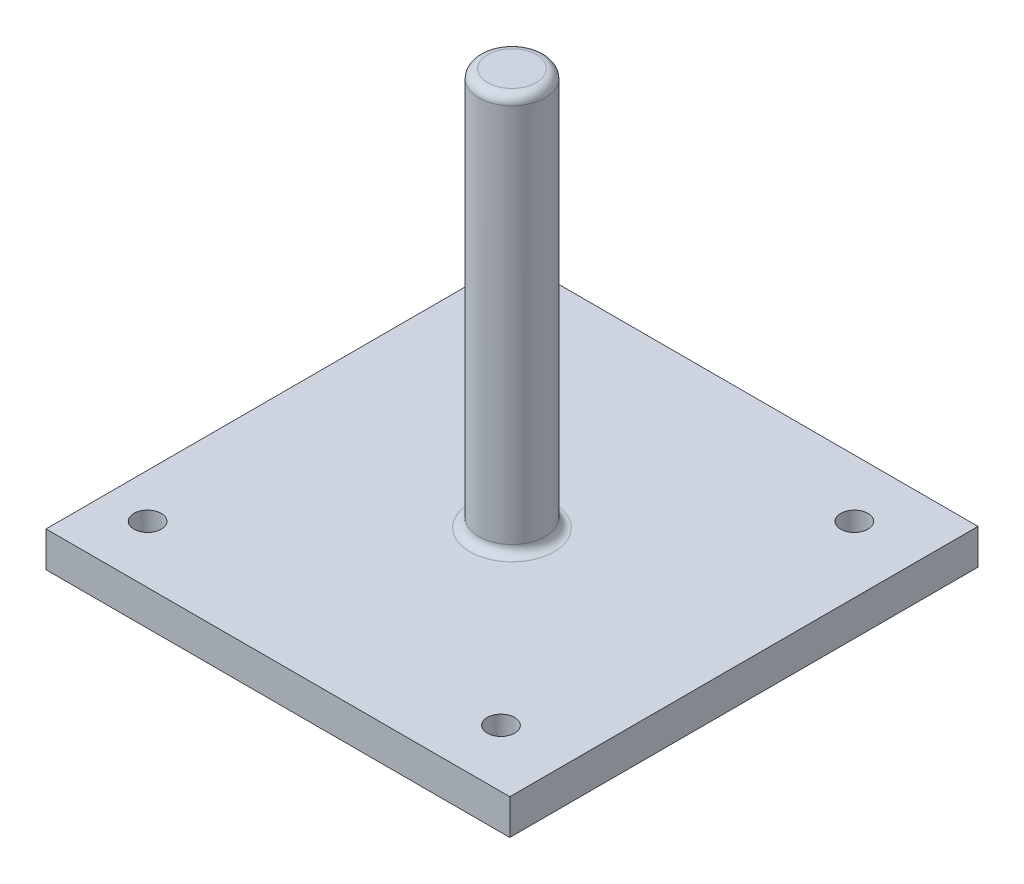
ISO-10303-21;
HEADER;
FILE_DESCRIPTION(('STEP AP214'),'2;1');
FILE_NAME('part.step','',(''),(''),'','','');
FILE_SCHEMA(('AUTOMOTIVE_DESIGN { 1 0 10303 214 1 1 1 1 }'));
ENDSEC;
DATA;
#1=APPLICATION_CONTEXT('core data for automotive mechanical design processes');
#2=APPLICATION_PROTOCOL_DEFINITION('international standard','automotive_design',2000,#1);
#3=PRODUCT_CONTEXT('',#1,'mechanical');
#4=PRODUCT('Part','Part','',(#3));
#5=PRODUCT_RELATED_PRODUCT_CATEGORY('part','',(#4));
#6=PRODUCT_DEFINITION_FORMATION('','',#4);
#7=PRODUCT_DEFINITION_CONTEXT('part definition',#1,'design');
#8=PRODUCT_DEFINITION('design','',#6,#7);
#9=PRODUCT_DEFINITION_SHAPE('','',#8);
#10=(LENGTH_UNIT() NAMED_UNIT(*) SI_UNIT(.MILLI.,.METRE.));
#11=(NAMED_UNIT(*) PLANE_ANGLE_UNIT() SI_UNIT($,.RADIAN.));
#12=(NAMED_UNIT(*) SI_UNIT($,.STERADIAN.) SOLID_ANGLE_UNIT());
#13=UNCERTAINTY_MEASURE_WITH_UNIT(LENGTH_MEASURE(1.E-05),#10,'distance_accuracy_value','');
#14=(GEOMETRIC_REPRESENTATION_CONTEXT(3) GLOBAL_UNCERTAINTY_ASSIGNED_CONTEXT((#13)) GLOBAL_UNIT_ASSIGNED_CONTEXT((#10,
#11,#12)) REPRESENTATION_CONTEXT('',''));
#15=CARTESIAN_POINT('',(0.,0.,0.));
#16=DIRECTION('',(0.,0.,1.));
#17=DIRECTION('',(1.,0.,0.));
#18=AXIS2_PLACEMENT_3D('',#15,#16,#17);
#19=CARTESIAN_POINT('',(0.,8.,0.));
#20=DIRECTION('',(1.,0.,0.));
#21=DIRECTION('',(0.,0.,-1.));
#22=AXIS2_PLACEMENT_3D('',#19,#20,#21);
#23=PLANE('',#22);
#24=DIRECTION('',(0.,0.,1.));
#25=VECTOR('',#24,1.);
#26=CARTESIAN_POINT('',(0.,0.,0.));
#27=LINE('',#26,#25);
#28=CARTESIAN_POINT('',(0.,0.,-106.));
#29=VERTEX_POINT('',#28);
#30=CARTESIAN_POINT('',(0.,0.,0.));
#31=VERTEX_POINT('',#30);
#32=EDGE_CURVE('E109',#29,#31,#27,.T.);
#33=ORIENTED_EDGE('',*,*,#32,.T.);
#34=DIRECTION('',(0.,-1.,0.));
#35=VECTOR('',#34,1.);
#36=CARTESIAN_POINT('',(0.,8.,0.));
#37=LINE('',#36,#35);
#38=CARTESIAN_POINT('',(0.,8.,0.));
#39=VERTEX_POINT('',#38);
#40=EDGE_CURVE('E100',#39,#31,#37,.T.);
#41=ORIENTED_EDGE('',*,*,#40,.F.);
#42=DIRECTION('',(0.,0.,1.));
#43=VECTOR('',#42,1.);
#44=CARTESIAN_POINT('',(0.,8.,0.));
#45=LINE('',#44,#43);
#46=CARTESIAN_POINT('',(0.,8.,-106.));
#47=VERTEX_POINT('',#46);
#48=EDGE_CURVE('E94',#47,#39,#45,.T.);
#49=ORIENTED_EDGE('',*,*,#48,.F.);
#50=DIRECTION('',(0.,-1.,0.));
#51=VECTOR('',#50,1.);
#52=CARTESIAN_POINT('',(0.,8.,-106.));
#53=LINE('',#52,#51);
#54=EDGE_CURVE('E105',#47,#29,#53,.T.);
#55=ORIENTED_EDGE('',*,*,#54,.T.);
#56=EDGE_LOOP('',(#33,#41,#49,#55));
#57=FACE_BOUND('',#56,.T.);
#58=ADVANCED_FACE('F41',(#57),#23,.F.);
#59=CARTESIAN_POINT('',(0.,8.,0.));
#60=DIRECTION('',(0.,0.,-1.));
#61=DIRECTION('',(-1.,0.,0.));
#62=AXIS2_PLACEMENT_3D('',#59,#60,#61);
#63=PLANE('',#62);
#64=DIRECTION('',(1.,0.,0.));
#65=VECTOR('',#64,1.);
#66=CARTESIAN_POINT('',(0.,0.,0.));
#67=LINE('',#66,#65);
#68=CARTESIAN_POINT('',(105.,0.,0.));
#69=VERTEX_POINT('',#68);
#70=EDGE_CURVE('E99',#31,#69,#67,.T.);
#71=ORIENTED_EDGE('',*,*,#70,.T.);
#72=DIRECTION('',(0.,-1.,0.));
#73=VECTOR('',#72,1.);
#74=CARTESIAN_POINT('',(105.,8.,0.));
#75=LINE('',#74,#73);
#76=CARTESIAN_POINT('',(105.,8.,0.));
#77=VERTEX_POINT('',#76);
#78=EDGE_CURVE('E97',#77,#69,#75,.T.);
#79=ORIENTED_EDGE('',*,*,#78,.F.);
#80=DIRECTION('',(1.,0.,0.));
#81=VECTOR('',#80,1.);
#82=CARTESIAN_POINT('',(0.,8.,0.));
#83=LINE('',#82,#81);
#84=EDGE_CURVE('E89',#39,#77,#83,.T.);
#85=ORIENTED_EDGE('',*,*,#84,.F.);
#86=ORIENTED_EDGE('',*,*,#40,.T.);
#87=EDGE_LOOP('',(#71,#79,#85,#86));
#88=FACE_BOUND('',#87,.T.);
#89=ADVANCED_FACE('F98',(#88),#63,.F.);
#90=CARTESIAN_POINT('',(105.,8.,0.));
#91=DIRECTION('',(-1.,0.,0.));
#92=DIRECTION('',(0.,0.,1.));
#93=AXIS2_PLACEMENT_3D('',#90,#91,#92);
#94=PLANE('',#93);
#95=DIRECTION('',(0.,0.,-1.));
#96=VECTOR('',#95,1.);
#97=CARTESIAN_POINT('',(105.,0.,0.));
#98=LINE('',#97,#96);
#99=CARTESIAN_POINT('',(105.,0.,-106.));
#100=VERTEX_POINT('',#99);
#101=EDGE_CURVE('E75',#69,#100,#98,.T.);
#102=ORIENTED_EDGE('',*,*,#101,.T.);
#103=DIRECTION('',(0.,-1.,0.));
#104=VECTOR('',#103,1.);
#105=CARTESIAN_POINT('',(105.,8.,-106.));
#106=LINE('',#105,#104);
#107=CARTESIAN_POINT('',(105.,8.,-106.));
#108=VERTEX_POINT('',#107);
#109=EDGE_CURVE('E101',#108,#100,#106,.T.);
#110=ORIENTED_EDGE('',*,*,#109,.F.);
#111=DIRECTION('',(0.,0.,-1.));
#112=VECTOR('',#111,1.);
#113=CARTESIAN_POINT('',(105.,8.,0.));
#114=LINE('',#113,#112);
#115=EDGE_CURVE('E92',#77,#108,#114,.T.);
#116=ORIENTED_EDGE('',*,*,#115,.F.);
#117=ORIENTED_EDGE('',*,*,#78,.T.);
#118=EDGE_LOOP('',(#102,#110,#116,#117));
#119=FACE_BOUND('',#118,.T.);
#120=ADVANCED_FACE('F103',(#119),#94,.F.);
#121=CARTESIAN_POINT('',(0.,8.,-106.));
#122=DIRECTION('',(0.,0.,1.));
#123=DIRECTION('',(1.,0.,0.));
#124=AXIS2_PLACEMENT_3D('',#121,#122,#123);
#125=PLANE('',#124);
#126=DIRECTION('',(-1.,0.,0.));
#127=VECTOR('',#126,1.);
#128=CARTESIAN_POINT('',(0.,0.,-106.));
#129=LINE('',#128,#127);
#130=EDGE_CURVE('E81',#100,#29,#129,.T.);
#131=ORIENTED_EDGE('',*,*,#130,.T.);
#132=ORIENTED_EDGE('',*,*,#54,.F.);
#133=DIRECTION('',(-1.,0.,0.));
#134=VECTOR('',#133,1.);
#135=CARTESIAN_POINT('',(0.,8.,-106.));
#136=LINE('',#135,#134);
#137=EDGE_CURVE('E58',#108,#47,#136,.T.);
#138=ORIENTED_EDGE('',*,*,#137,.F.);
#139=ORIENTED_EDGE('',*,*,#109,.T.);
#140=EDGE_LOOP('',(#131,#132,#138,#139));
#141=FACE_BOUND('',#140,.T.);
#142=ADVANCED_FACE('F172',(#141),#125,.F.);
#143=CARTESIAN_POINT('',(0.,8.,0.));
#144=DIRECTION('',(0.,-1.,0.));
#145=DIRECTION('',(0.,0.,-1.));
#146=AXIS2_PLACEMENT_3D('',#143,#144,#145);
#147=PLANE('',#146);
#148=CARTESIAN_POINT('',(52.5,8.,-53.0000000000002));
#149=DIRECTION('',(0.,-1.,0.));
#150=DIRECTION('',(0.,0.,-1.));
#151=AXIS2_PLACEMENT_3D('',#148,#149,#150);
#152=CIRCLE('',#151,9.5);
#153=CARTESIAN_POINT('',(52.5,8.,-62.5000000000002));
#154=VERTEX_POINT('',#153);
#155=EDGE_CURVE('E50',#154,#154,#152,.T.);
#156=ORIENTED_EDGE('',*,*,#155,.T.);
#157=EDGE_LOOP('',(#156));
#158=FACE_BOUND('',#157,.T.);
#159=CARTESIAN_POINT('',(10.0000000000007,8.,-13.0000000000004));
#160=DIRECTION('',(0.,1.,0.));
#161=DIRECTION('',(0.,0.,1.));
#162=AXIS2_PLACEMENT_3D('',#159,#160,#161);
#163=CIRCLE('',#162,3.1);
#164=CARTESIAN_POINT('',(10.0000000000007,8.,-9.90000000000038));
#165=VERTEX_POINT('',#164);
#166=EDGE_CURVE('E208',#165,#165,#163,.T.);
#167=ORIENTED_EDGE('',*,*,#166,.F.);
#168=EDGE_LOOP('',(#167));
#169=FACE_BOUND('',#168,.T.);
#170=CARTESIAN_POINT('',(10.0000000000004,8.,-93.0000000000004));
#171=DIRECTION('',(0.,1.,0.));
#172=DIRECTION('',(0.,0.,1.));
#173=AXIS2_PLACEMENT_3D('',#170,#171,#172);
#174=CIRCLE('',#173,3.10000000000001);
#175=CARTESIAN_POINT('',(10.0000000000004,8.,-89.9000000000004));
#176=VERTEX_POINT('',#175);
#177=EDGE_CURVE('E203',#176,#176,#174,.T.);
#178=ORIENTED_EDGE('',*,*,#177,.F.);
#179=EDGE_LOOP('',(#178));
#180=FACE_BOUND('',#179,.T.);
#181=CARTESIAN_POINT('',(90.0000000000004,8.,-93.0000000000006));
#182=DIRECTION('',(0.,1.,0.));
#183=DIRECTION('',(0.,0.,1.));
#184=AXIS2_PLACEMENT_3D('',#181,#182,#183);
#185=CIRCLE('',#184,3.1);
#186=CARTESIAN_POINT('',(90.0000000000004,8.,-89.9000000000006));
#187=VERTEX_POINT('',#186);
#188=EDGE_CURVE('E201',#187,#187,#185,.T.);
#189=ORIENTED_EDGE('',*,*,#188,.F.);
#190=EDGE_LOOP('',(#189));
#191=FACE_BOUND('',#190,.T.);
#192=CARTESIAN_POINT('',(90.0000000000007,8.,-13.0000000000006));
#193=DIRECTION('',(0.,1.,0.));
#194=DIRECTION('',(0.,0.,1.));
#195=AXIS2_PLACEMENT_3D('',#192,#193,#194);
#196=CIRCLE('',#195,3.1);
#197=CARTESIAN_POINT('',(90.0000000000007,8.,-9.90000000000059));
#198=VERTEX_POINT('',#197);
#199=EDGE_CURVE('E124',#198,#198,#196,.T.);
#200=ORIENTED_EDGE('',*,*,#199,.F.);
#201=EDGE_LOOP('',(#200));
#202=FACE_BOUND('',#201,.T.);
#203=ORIENTED_EDGE('',*,*,#48,.T.);
#204=ORIENTED_EDGE('',*,*,#84,.T.);
#205=ORIENTED_EDGE('',*,*,#115,.T.);
#206=ORIENTED_EDGE('',*,*,#137,.T.);
#207=EDGE_LOOP('',(#203,#204,#205,#206));
#208=FACE_BOUND('',#207,.T.);
#209=ADVANCED_FACE('F90',(#158,#169,#180,#191,#202,#208),#147,.F.);
#210=CARTESIAN_POINT('',(0.,0.,0.));
#211=DIRECTION('',(0.,-1.,0.));
#212=DIRECTION('',(0.,0.,-1.));
#213=AXIS2_PLACEMENT_3D('',#210,#211,#212);
#214=PLANE('',#213);
#215=CARTESIAN_POINT('',(10.0000000000007,0.,-13.0000000000004));
#216=DIRECTION('',(0.,-1.,0.));
#217=DIRECTION('',(0.,0.,-1.));
#218=AXIS2_PLACEMENT_3D('',#215,#216,#217);
#219=CIRCLE('',#218,3.1);
#220=CARTESIAN_POINT('',(10.0000000000007,0.,-16.1000000000004));
#221=VERTEX_POINT('',#220);
#222=EDGE_CURVE('E112',#221,#221,#219,.T.);
#223=ORIENTED_EDGE('',*,*,#222,.F.);
#224=EDGE_LOOP('',(#223));
#225=FACE_BOUND('',#224,.T.);
#226=CARTESIAN_POINT('',(10.0000000000004,0.,-93.0000000000004));
#227=DIRECTION('',(0.,-1.,0.));
#228=DIRECTION('',(0.,0.,-1.));
#229=AXIS2_PLACEMENT_3D('',#226,#227,#228);
#230=CIRCLE('',#229,3.10000000000001);
#231=CARTESIAN_POINT('',(10.0000000000004,0.,-96.1000000000004));
#232=VERTEX_POINT('',#231);
#233=EDGE_CURVE('E127',#232,#232,#230,.T.);
#234=ORIENTED_EDGE('',*,*,#233,.F.);
#235=EDGE_LOOP('',(#234));
#236=FACE_BOUND('',#235,.T.);
#237=CARTESIAN_POINT('',(90.0000000000004,0.,-93.0000000000006));
#238=DIRECTION('',(0.,-1.,0.));
#239=DIRECTION('',(0.,0.,-1.));
#240=AXIS2_PLACEMENT_3D('',#237,#238,#239);
#241=CIRCLE('',#240,3.1);
#242=CARTESIAN_POINT('',(90.0000000000004,0.,-96.1000000000006));
#243=VERTEX_POINT('',#242);
#244=EDGE_CURVE('E123',#243,#243,#241,.T.);
#245=ORIENTED_EDGE('',*,*,#244,.F.);
#246=EDGE_LOOP('',(#245));
#247=FACE_BOUND('',#246,.T.);
#248=CARTESIAN_POINT('',(90.0000000000007,0.,-13.0000000000006));
#249=DIRECTION('',(0.,-1.,0.));
#250=DIRECTION('',(0.,0.,-1.));
#251=AXIS2_PLACEMENT_3D('',#248,#249,#250);
#252=CIRCLE('',#251,3.1);
#253=CARTESIAN_POINT('',(90.0000000000007,0.,-16.1000000000006));
#254=VERTEX_POINT('',#253);
#255=EDGE_CURVE('E120',#254,#254,#252,.T.);
#256=ORIENTED_EDGE('',*,*,#255,.F.);
#257=EDGE_LOOP('',(#256));
#258=FACE_BOUND('',#257,.T.);
#259=ORIENTED_EDGE('',*,*,#32,.F.);
#260=ORIENTED_EDGE('',*,*,#130,.F.);
#261=ORIENTED_EDGE('',*,*,#101,.F.);
#262=ORIENTED_EDGE('',*,*,#70,.F.);
#263=EDGE_LOOP('',(#259,#260,#261,#262));
#264=FACE_BOUND('',#263,.T.);
#265=ADVANCED_FACE('F175',(#225,#236,#247,#258,#264),#214,.T.);
#266=CARTESIAN_POINT('',(90.0000000000007,-2.,-13.0000000000006));
#267=DIRECTION('',(0.,1.,0.));
#268=DIRECTION('',(0.,0.,1.));
#269=AXIS2_PLACEMENT_3D('',#266,#267,#268);
#270=CYLINDRICAL_SURFACE('',#269,3.1);
#271=ORIENTED_EDGE('',*,*,#255,.T.);
#272=EDGE_LOOP('',(#271));
#273=FACE_BOUND('',#272,.T.);
#274=ORIENTED_EDGE('',*,*,#199,.T.);
#275=EDGE_LOOP('',(#274));
#276=FACE_BOUND('',#275,.T.);
#277=ADVANCED_FACE('F178',(#273,#276),#270,.F.);
#278=CARTESIAN_POINT('',(90.0000000000004,-2.,-93.0000000000006));
#279=DIRECTION('',(0.,1.,0.));
#280=DIRECTION('',(0.,0.,1.));
#281=AXIS2_PLACEMENT_3D('',#278,#279,#280);
#282=CYLINDRICAL_SURFACE('',#281,3.1);
#283=ORIENTED_EDGE('',*,*,#244,.T.);
#284=EDGE_LOOP('',(#283));
#285=FACE_BOUND('',#284,.T.);
#286=ORIENTED_EDGE('',*,*,#188,.T.);
#287=EDGE_LOOP('',(#286));
#288=FACE_BOUND('',#287,.T.);
#289=ADVANCED_FACE('F184',(#285,#288),#282,.F.);
#290=CARTESIAN_POINT('',(10.0000000000004,-2.,-93.0000000000004));
#291=DIRECTION('',(0.,1.,0.));
#292=DIRECTION('',(0.,0.,1.));
#293=AXIS2_PLACEMENT_3D('',#290,#291,#292);
#294=CYLINDRICAL_SURFACE('',#293,3.10000000000001);
#295=ORIENTED_EDGE('',*,*,#233,.T.);
#296=EDGE_LOOP('',(#295));
#297=FACE_BOUND('',#296,.T.);
#298=ORIENTED_EDGE('',*,*,#177,.T.);
#299=EDGE_LOOP('',(#298));
#300=FACE_BOUND('',#299,.T.);
#301=ADVANCED_FACE('F188',(#297,#300),#294,.F.);
#302=CARTESIAN_POINT('',(10.0000000000007,-2.,-13.0000000000004));
#303=DIRECTION('',(0.,1.,0.));
#304=DIRECTION('',(0.,0.,1.));
#305=AXIS2_PLACEMENT_3D('',#302,#303,#304);
#306=CYLINDRICAL_SURFACE('',#305,3.1);
#307=ORIENTED_EDGE('',*,*,#222,.T.);
#308=EDGE_LOOP('',(#307));
#309=FACE_BOUND('',#308,.T.);
#310=ORIENTED_EDGE('',*,*,#166,.T.);
#311=EDGE_LOOP('',(#310));
#312=FACE_BOUND('',#311,.T.);
#313=ADVANCED_FACE('F150',(#309,#312),#306,.F.);
#314=CARTESIAN_POINT('',(52.5,98.,-53.0000000000002));
#315=DIRECTION('',(0.,-1.,0.));
#316=DIRECTION('',(0.,0.,-1.));
#317=AXIS2_PLACEMENT_3D('',#314,#315,#316);
#318=CYLINDRICAL_SURFACE('',#317,7.5);
#319=CARTESIAN_POINT('',(52.5,9.99999999999999,-53.0000000000002));
#320=DIRECTION('',(0.,-1.,0.));
#321=DIRECTION('',(0.,0.,-1.));
#322=AXIS2_PLACEMENT_3D('',#319,#320,#321);
#323=CIRCLE('',#322,7.5);
#324=CARTESIAN_POINT('',(52.5,9.99999999999999,-60.5000000000002));
#325=VERTEX_POINT('',#324);
#326=EDGE_CURVE('E134',#325,#325,#323,.F.);
#327=CARTESIAN_POINT('',(52.5,96.,-53.0000000000002));
#328=DIRECTION('',(0.,1.,0.));
#329=DIRECTION('',(0.,0.,1.));
#330=AXIS2_PLACEMENT_3D('',#327,#328,#329);
#331=CIRCLE('',#330,7.5);
#332=CARTESIAN_POINT('',(52.5,96.,-60.5000000000002));
#333=VERTEX_POINT('',#332);
#334=EDGE_CURVE('E119',#333,#333,#331,.F.);
#335=CARTESIAN_POINT('',(52.5,9.99999999999999,-60.5000000000002));
#336=CARTESIAN_POINT('',(52.5,10.8958333333333,-60.5000000000002));
#337=CARTESIAN_POINT('',(52.5,11.7916666666667,-60.5000000000002));
#338=CARTESIAN_POINT('',(52.5,13.5833333333333,-60.5000000000002));
#339=CARTESIAN_POINT('',(52.5,14.4791666666667,-60.5000000000002));
#340=CARTESIAN_POINT('',(52.5,16.2708333333333,-60.5000000000002));
#341=CARTESIAN_POINT('',(52.5,17.1666666666667,-60.5000000000002));
#342=CARTESIAN_POINT('',(52.5,18.9583333333333,-60.5000000000002));
#343=CARTESIAN_POINT('',(52.5,19.8541666666667,-60.5000000000002));
#344=CARTESIAN_POINT('',(52.5,21.6458333333333,-60.5000000000002));
#345=CARTESIAN_POINT('',(52.5,22.5416666666667,-60.5000000000002));
#346=CARTESIAN_POINT('',(52.5,24.3333333333333,-60.5000000000002));
#347=CARTESIAN_POINT('',(52.5,25.2291666666667,-60.5000000000002));
#348=CARTESIAN_POINT('',(52.5,27.0208333333333,-60.5000000000002));
#349=CARTESIAN_POINT('',(52.5,27.9166666666667,-60.5000000000002));
#350=CARTESIAN_POINT('',(52.5,29.7083333333333,-60.5000000000002));
#351=CARTESIAN_POINT('',(52.5,30.6041666666667,-60.5000000000002));
#352=CARTESIAN_POINT('',(52.5,32.3958333333333,-60.5000000000002));
#353=CARTESIAN_POINT('',(52.5,33.2916666666667,-60.5000000000002));
#354=CARTESIAN_POINT('',(52.5,35.0833333333333,-60.5000000000002));
#355=CARTESIAN_POINT('',(52.5,35.9791666666667,-60.5000000000002));
#356=CARTESIAN_POINT('',(52.5,37.7708333333333,-60.5000000000002));
#357=CARTESIAN_POINT('',(52.5,38.6666666666667,-60.5000000000002));
#358=CARTESIAN_POINT('',(52.5,40.4583333333333,-60.5000000000002));
#359=CARTESIAN_POINT('',(52.5,41.3541666666667,-60.5000000000002));
#360=CARTESIAN_POINT('',(52.5,43.1458333333333,-60.5000000000002));
#361=CARTESIAN_POINT('',(52.5,44.0416666666667,-60.5000000000002));
#362=CARTESIAN_POINT('',(52.5,45.8333333333333,-60.5000000000002));
#363=CARTESIAN_POINT('',(52.5,46.7291666666667,-60.5000000000002));
#364=CARTESIAN_POINT('',(52.5,48.5208333333333,-60.5000000000002));
#365=CARTESIAN_POINT('',(52.5,49.4166666666667,-60.5000000000002));
#366=CARTESIAN_POINT('',(52.5,51.2083333333333,-60.5000000000002));
#367=CARTESIAN_POINT('',(52.5,52.1041666666667,-60.5000000000002));
#368=CARTESIAN_POINT('',(52.5,53.8958333333333,-60.5000000000002));
#369=CARTESIAN_POINT('',(52.5,54.7916666666667,-60.5000000000002));
#370=CARTESIAN_POINT('',(52.5,56.5833333333333,-60.5000000000002));
#371=CARTESIAN_POINT('',(52.5,57.4791666666667,-60.5000000000002));
#372=CARTESIAN_POINT('',(52.5,59.2708333333333,-60.5000000000002));
#373=CARTESIAN_POINT('',(52.5,60.1666666666667,-60.5000000000002));
#374=CARTESIAN_POINT('',(52.5,61.9583333333333,-60.5000000000002));
#375=CARTESIAN_POINT('',(52.5,62.8541666666667,-60.5000000000002));
#376=CARTESIAN_POINT('',(52.5,64.6458333333333,-60.5000000000002));
#377=CARTESIAN_POINT('',(52.5,65.5416666666667,-60.5000000000002));
#378=CARTESIAN_POINT('',(52.5,67.3333333333333,-60.5000000000002));
#379=CARTESIAN_POINT('',(52.5,68.2291666666667,-60.5000000000002));
#380=CARTESIAN_POINT('',(52.5,70.0208333333333,-60.5000000000002));
#381=CARTESIAN_POINT('',(52.5,70.9166666666667,-60.5000000000002));
#382=CARTESIAN_POINT('',(52.5,72.7083333333333,-60.5000000000002));
#383=CARTESIAN_POINT('',(52.5,73.6041666666667,-60.5000000000002));
#384=CARTESIAN_POINT('',(52.5,75.3958333333333,-60.5000000000002));
#385=CARTESIAN_POINT('',(52.5,76.2916666666667,-60.5000000000002));
#386=CARTESIAN_POINT('',(52.5,78.0833333333333,-60.5000000000002));
#387=CARTESIAN_POINT('',(52.5,78.9791666666667,-60.5000000000002));
#388=CARTESIAN_POINT('',(52.5,80.7708333333333,-60.5000000000002));
#389=CARTESIAN_POINT('',(52.5,81.6666666666667,-60.5000000000002));
#390=CARTESIAN_POINT('',(52.5,83.4583333333333,-60.5000000000002));
#391=CARTESIAN_POINT('',(52.5,84.3541666666667,-60.5000000000002));
#392=CARTESIAN_POINT('',(52.5,86.1458333333333,-60.5000000000002));
#393=CARTESIAN_POINT('',(52.5,87.0416666666667,-60.5000000000002));
#394=CARTESIAN_POINT('',(52.5,88.8333333333333,-60.5000000000002));
#395=CARTESIAN_POINT('',(52.5,89.7291666666667,-60.5000000000002));
#396=CARTESIAN_POINT('',(52.5,91.5208333333333,-60.5000000000002));
#397=CARTESIAN_POINT('',(52.5,92.4166666666667,-60.5000000000002));
#398=CARTESIAN_POINT('',(52.5,94.2083333333333,-60.5000000000002));
#399=CARTESIAN_POINT('',(52.5,95.1041666666667,-60.5000000000002));
#400=CARTESIAN_POINT('',(52.5,96.,-60.5000000000002));
#401=B_SPLINE_CURVE_WITH_KNOTS('',3,(#335,#336,#337,#338,#339,#340,#341,#342,#343,#344,#345,
#346,#347,#348,#349,#350,#351,#352,#353,#354,#355,#356,#357,#358,#359,#360,#361,#362,#363,#364,
#365,#366,#367,#368,#369,#370,#371,#372,#373,#374,#375,#376,#377,#378,#379,#380,#381,#382,#383,
#384,#385,#386,#387,#388,#389,#390,#391,#392,#393,#394,#395,#396,#397,#398,#399,#400),
.UNSPECIFIED.,.F.,.F.,(4,2,2,2,2,2,2,2,2,2,2,2,2,2,2,2,2,2,2,2,2,2,2,2,2,2,2,2,2,2,2,2,4),(0.,
2.6875,5.375,8.0625,10.75,13.4375,16.125,18.8125,21.5,24.1875,26.875,29.5625,32.25,34.9375,
37.625,40.3125,43.,45.6875,48.375,51.0625,53.75,56.4375,59.125,61.8125,64.5,67.1875,69.875,
72.5625,75.25,77.9375,80.625,83.3125,86.),.UNSPECIFIED.);
#402=EDGE_CURVE('BSEAM147',#325,#333,#401,.T.);
#403=ORIENTED_EDGE('',*,*,#326,.T.);
#404=ORIENTED_EDGE('',*,*,#334,.T.);
#405=ORIENTED_EDGE('',*,*,#402,.T.);
#406=ORIENTED_EDGE('',*,*,#402,.F.);
#407=EDGE_LOOP('',(#403,#405,#404,#406));
#408=FACE_BOUND('',#407,.T.);
#409=ADVANCED_FACE('F147',(#408),#318,.T.);
#410=CARTESIAN_POINT('',(52.5,98.,-53.0000000000002));
#411=DIRECTION('',(0.,1.,0.));
#412=DIRECTION('',(0.,0.,1.));
#413=AXIS2_PLACEMENT_3D('',#410,#411,#412);
#414=PLANE('',#413);
#415=CARTESIAN_POINT('',(52.5,98.,-53.0000000000002));
#416=DIRECTION('',(0.,1.,0.));
#417=DIRECTION('',(0.,0.,1.));
#418=AXIS2_PLACEMENT_3D('',#415,#416,#417);
#419=CIRCLE('',#418,5.5);
#420=CARTESIAN_POINT('',(52.5,98.,-47.5000000000002));
#421=VERTEX_POINT('',#420);
#422=EDGE_CURVE('E11',#421,#421,#419,.T.);
#423=ORIENTED_EDGE('',*,*,#422,.T.);
#424=EDGE_LOOP('',(#423));
#425=FACE_BOUND('',#424,.T.);
#426=ADVANCED_FACE('F144',(#425),#414,.T.);
#427=CARTESIAN_POINT('',(52.5,9.99999999999999,-53.0000000000002));
#428=DIRECTION('',(0.,-1.,0.));
#429=DIRECTION('',(0.,0.,-1.));
#430=AXIS2_PLACEMENT_3D('',#427,#428,#429);
#431=TOROIDAL_SURFACE('',#430,9.5,2.);
#432=ORIENTED_EDGE('',*,*,#155,.F.);
#433=EDGE_LOOP('',(#432));
#434=FACE_BOUND('',#433,.T.);
#435=ORIENTED_EDGE('',*,*,#326,.F.);
#436=EDGE_LOOP('',(#435));
#437=FACE_BOUND('',#436,.T.);
#438=ADVANCED_FACE('F141',(#434,#437),#431,.F.);
#439=CARTESIAN_POINT('',(52.5,96.,-53.0000000000002));
#440=DIRECTION('',(0.,1.,0.));
#441=DIRECTION('',(0.,0.,1.));
#442=AXIS2_PLACEMENT_3D('',#439,#440,#441);
#443=TOROIDAL_SURFACE('',#442,5.5,2.);
#444=ORIENTED_EDGE('',*,*,#334,.F.);
#445=EDGE_LOOP('',(#444));
#446=FACE_BOUND('',#445,.T.);
#447=ORIENTED_EDGE('',*,*,#422,.F.);
#448=EDGE_LOOP('',(#447));
#449=FACE_BOUND('',#448,.T.);
#450=ADVANCED_FACE('F43',(#446,#449),#443,.T.);
#451=CLOSED_SHELL('',(#58,#89,#120,#142,#209,#265,#277,#289,#301,#313,#409,#426,#438,#450));
#452=MANIFOLD_SOLID_BREP('B2',#451);
#453=ADVANCED_BREP_SHAPE_REPRESENTATION('',(#18,#452),#14);
#454=SHAPE_DEFINITION_REPRESENTATION(#9,#453);
ENDSEC;
END-ISO-10303-21;
